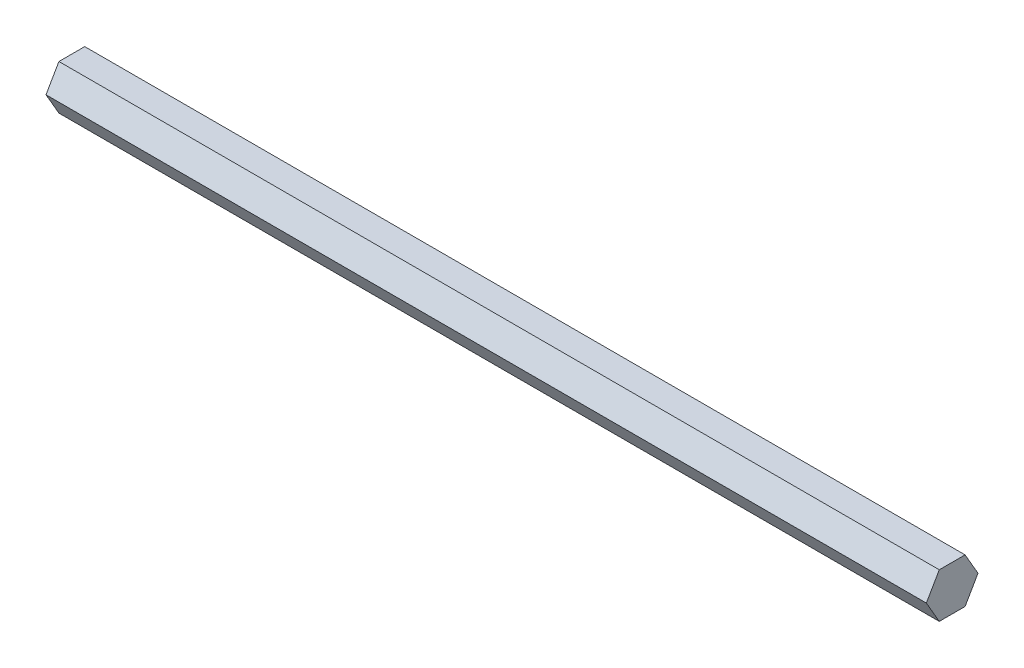
ISO-10303-21;
HEADER;
FILE_DESCRIPTION(('STEP AP214'),'2;1');
FILE_NAME('part.step','',(''),(''),'','','');
FILE_SCHEMA(('AUTOMOTIVE_DESIGN { 1 0 10303 214 1 1 1 1 }'));
ENDSEC;
DATA;
#1=APPLICATION_CONTEXT('core data for automotive mechanical design processes');
#2=APPLICATION_PROTOCOL_DEFINITION('international standard','automotive_design',2000,#1);
#3=PRODUCT_CONTEXT('',#1,'mechanical');
#4=PRODUCT('Part','Part','',(#3));
#5=PRODUCT_RELATED_PRODUCT_CATEGORY('part','',(#4));
#6=PRODUCT_DEFINITION_FORMATION('','',#4);
#7=PRODUCT_DEFINITION_CONTEXT('part definition',#1,'design');
#8=PRODUCT_DEFINITION('design','',#6,#7);
#9=PRODUCT_DEFINITION_SHAPE('','',#8);
#10=(LENGTH_UNIT() NAMED_UNIT(*) SI_UNIT(.MILLI.,.METRE.));
#11=(NAMED_UNIT(*) PLANE_ANGLE_UNIT() SI_UNIT($,.RADIAN.));
#12=(NAMED_UNIT(*) SI_UNIT($,.STERADIAN.) SOLID_ANGLE_UNIT());
#13=UNCERTAINTY_MEASURE_WITH_UNIT(LENGTH_MEASURE(1.E-05),#10,'distance_accuracy_value','');
#14=(GEOMETRIC_REPRESENTATION_CONTEXT(3) GLOBAL_UNCERTAINTY_ASSIGNED_CONTEXT((#13)) GLOBAL_UNIT_ASSIGNED_CONTEXT((#10,
#11,#12)) REPRESENTATION_CONTEXT('',''));
#15=CARTESIAN_POINT('',(0.,0.,0.));
#16=DIRECTION('',(0.,0.,1.));
#17=DIRECTION('',(1.,0.,0.));
#18=AXIS2_PLACEMENT_3D('',#15,#16,#17);
#19=CARTESIAN_POINT('',(250.,-6.34999999999995,-3.66617420935419));
#20=DIRECTION('',(0.,0.499999999999995,0.866025403784442));
#21=DIRECTION('',(0.,-0.866025403784442,0.499999999999995));
#22=AXIS2_PLACEMENT_3D('',#19,#20,#21);
#23=PLANE('',#22);
#24=DIRECTION('',(0.,0.866025403784442,-0.499999999999995));
#25=VECTOR('',#24,1.);
#26=CARTESIAN_POINT('',(0.,-6.34999999999995,-3.66617420935419));
#27=LINE('',#26,#25);
#28=CARTESIAN_POINT('',(0.,-6.34999999999995,-3.66617420935419));
#29=VERTEX_POINT('',#28);
#30=CARTESIAN_POINT('',(0.,0.,-7.33234841870824));
#31=VERTEX_POINT('',#30);
#32=EDGE_CURVE('E128',#29,#31,#27,.T.);
#33=ORIENTED_EDGE('',*,*,#32,.T.);
#34=DIRECTION('',(-1.,0.,0.));
#35=VECTOR('',#34,1.);
#36=CARTESIAN_POINT('',(250.,0.,-7.33234841870824));
#37=LINE('',#36,#35);
#38=CARTESIAN_POINT('',(250.,0.,-7.33234841870824));
#39=VERTEX_POINT('',#38);
#40=EDGE_CURVE('E11',#39,#31,#37,.T.);
#41=ORIENTED_EDGE('',*,*,#40,.F.);
#42=DIRECTION('',(0.,0.866025403784442,-0.499999999999995));
#43=VECTOR('',#42,1.);
#44=CARTESIAN_POINT('',(250.,-6.34999999999995,-3.66617420935419));
#45=LINE('',#44,#43);
#46=CARTESIAN_POINT('',(250.,-6.34999999999995,-3.66617420935419));
#47=VERTEX_POINT('',#46);
#48=EDGE_CURVE('E144',#47,#39,#45,.T.);
#49=ORIENTED_EDGE('',*,*,#48,.F.);
#50=DIRECTION('',(-1.,0.,0.));
#51=VECTOR('',#50,1.);
#52=CARTESIAN_POINT('',(250.,-6.34999999999995,-3.66617420935419));
#53=LINE('',#52,#51);
#54=EDGE_CURVE('E124',#47,#29,#53,.T.);
#55=ORIENTED_EDGE('',*,*,#54,.T.);
#56=EDGE_LOOP('',(#33,#41,#49,#55));
#57=FACE_BOUND('',#56,.T.);
#58=ADVANCED_FACE('F39',(#57),#23,.F.);
#59=CARTESIAN_POINT('',(250.,0.,-7.33234841870824));
#60=DIRECTION('',(0.,-0.500000000000001,0.866025403784438));
#61=DIRECTION('',(0.,-0.866025403784438,-0.500000000000001));
#62=AXIS2_PLACEMENT_3D('',#59,#60,#61);
#63=PLANE('',#62);
#64=DIRECTION('',(0.,0.866025403784438,0.500000000000001));
#65=VECTOR('',#64,1.);
#66=CARTESIAN_POINT('',(0.,0.,-7.33234841870824));
#67=LINE('',#66,#65);
#68=CARTESIAN_POINT('',(0.,6.35,-3.6661742093541));
#69=VERTEX_POINT('',#68);
#70=EDGE_CURVE('E132',#31,#69,#67,.T.);
#71=ORIENTED_EDGE('',*,*,#70,.T.);
#72=DIRECTION('',(-1.,0.,0.));
#73=VECTOR('',#72,1.);
#74=CARTESIAN_POINT('',(250.,6.35,-3.6661742093541));
#75=LINE('',#74,#73);
#76=CARTESIAN_POINT('',(250.,6.35,-3.6661742093541));
#77=VERTEX_POINT('',#76);
#78=EDGE_CURVE('E48',#77,#69,#75,.T.);
#79=ORIENTED_EDGE('',*,*,#78,.F.);
#80=DIRECTION('',(0.,0.866025403784438,0.500000000000001));
#81=VECTOR('',#80,1.);
#82=CARTESIAN_POINT('',(250.,0.,-7.33234841870824));
#83=LINE('',#82,#81);
#84=EDGE_CURVE('E93',#39,#77,#83,.T.);
#85=ORIENTED_EDGE('',*,*,#84,.F.);
#86=ORIENTED_EDGE('',*,*,#40,.T.);
#87=EDGE_LOOP('',(#71,#79,#85,#86));
#88=FACE_BOUND('',#87,.T.);
#89=ADVANCED_FACE('F172',(#88),#63,.F.);
#90=CARTESIAN_POINT('',(250.,6.35,-3.6661742093541));
#91=DIRECTION('',(0.,-1.,0.));
#92=DIRECTION('',(0.,0.,-1.));
#93=AXIS2_PLACEMENT_3D('',#90,#91,#92);
#94=PLANE('',#93);
#95=DIRECTION('',(0.,0.,1.));
#96=VECTOR('',#95,1.);
#97=CARTESIAN_POINT('',(0.,6.35,-3.6661742093541));
#98=LINE('',#97,#96);
#99=CARTESIAN_POINT('',(0.,6.34999999999998,3.66617420935415));
#100=VERTEX_POINT('',#99);
#101=EDGE_CURVE('E135',#69,#100,#98,.T.);
#102=ORIENTED_EDGE('',*,*,#101,.T.);
#103=DIRECTION('',(-1.,0.,0.));
#104=VECTOR('',#103,1.);
#105=CARTESIAN_POINT('',(250.,6.34999999999998,3.66617420935415));
#106=LINE('',#105,#104);
#107=CARTESIAN_POINT('',(250.,6.34999999999998,3.66617420935415));
#108=VERTEX_POINT('',#107);
#109=EDGE_CURVE('E117',#108,#100,#106,.T.);
#110=ORIENTED_EDGE('',*,*,#109,.F.);
#111=DIRECTION('',(0.,0.,1.));
#112=VECTOR('',#111,1.);
#113=CARTESIAN_POINT('',(250.,6.35,-3.6661742093541));
#114=LINE('',#113,#112);
#115=EDGE_CURVE('E106',#77,#108,#114,.T.);
#116=ORIENTED_EDGE('',*,*,#115,.F.);
#117=ORIENTED_EDGE('',*,*,#78,.T.);
#118=EDGE_LOOP('',(#102,#110,#116,#117));
#119=FACE_BOUND('',#118,.T.);
#120=ADVANCED_FACE('F154',(#119),#94,.F.);
#121=CARTESIAN_POINT('',(250.,6.34999999999998,3.66617420935415));
#122=DIRECTION('',(0.,-0.499999999999995,-0.866025403784442));
#123=DIRECTION('',(0.,0.866025403784442,-0.499999999999995));
#124=AXIS2_PLACEMENT_3D('',#121,#122,#123);
#125=PLANE('',#124);
#126=DIRECTION('',(0.,-0.866025403784442,0.499999999999995));
#127=VECTOR('',#126,1.);
#128=CARTESIAN_POINT('',(0.,6.34999999999998,3.66617420935415));
#129=LINE('',#128,#127);
#130=CARTESIAN_POINT('',(0.,0.,7.33234841870824));
#131=VERTEX_POINT('',#130);
#132=EDGE_CURVE('E115',#100,#131,#129,.T.);
#133=ORIENTED_EDGE('',*,*,#132,.T.);
#134=DIRECTION('',(-1.,0.,0.));
#135=VECTOR('',#134,1.);
#136=CARTESIAN_POINT('',(250.,0.,7.33234841870824));
#137=LINE('',#136,#135);
#138=CARTESIAN_POINT('',(250.,0.,7.33234841870824));
#139=VERTEX_POINT('',#138);
#140=EDGE_CURVE('E112',#139,#131,#137,.T.);
#141=ORIENTED_EDGE('',*,*,#140,.F.);
#142=DIRECTION('',(0.,-0.866025403784442,0.499999999999995));
#143=VECTOR('',#142,1.);
#144=CARTESIAN_POINT('',(250.,6.34999999999998,3.66617420935415));
#145=LINE('',#144,#143);
#146=EDGE_CURVE('E100',#108,#139,#145,.T.);
#147=ORIENTED_EDGE('',*,*,#146,.F.);
#148=ORIENTED_EDGE('',*,*,#109,.T.);
#149=EDGE_LOOP('',(#133,#141,#147,#148));
#150=FACE_BOUND('',#149,.T.);
#151=ADVANCED_FACE('F113',(#150),#125,.F.);
#152=CARTESIAN_POINT('',(250.,0.,7.33234841870824));
#153=DIRECTION('',(0.,0.500000000000007,-0.866025403784435));
#154=DIRECTION('',(0.,0.866025403784435,0.500000000000007));
#155=AXIS2_PLACEMENT_3D('',#152,#153,#154);
#156=PLANE('',#155);
#157=DIRECTION('',(0.,-0.866025403784435,-0.500000000000007));
#158=VECTOR('',#157,1.);
#159=CARTESIAN_POINT('',(0.,0.,7.33234841870824));
#160=LINE('',#159,#158);
#161=CARTESIAN_POINT('',(0.,-6.35000000000003,3.66617420935406));
#162=VERTEX_POINT('',#161);
#163=EDGE_CURVE('E79',#131,#162,#160,.T.);
#164=ORIENTED_EDGE('',*,*,#163,.T.);
#165=DIRECTION('',(-1.,0.,0.));
#166=VECTOR('',#165,1.);
#167=CARTESIAN_POINT('',(250.,-6.35000000000003,3.66617420935406));
#168=LINE('',#167,#166);
#169=CARTESIAN_POINT('',(250.,-6.35000000000003,3.66617420935406));
#170=VERTEX_POINT('',#169);
#171=EDGE_CURVE('E118',#170,#162,#168,.T.);
#172=ORIENTED_EDGE('',*,*,#171,.F.);
#173=DIRECTION('',(0.,-0.866025403784435,-0.500000000000007));
#174=VECTOR('',#173,1.);
#175=CARTESIAN_POINT('',(250.,0.,7.33234841870824));
#176=LINE('',#175,#174);
#177=EDGE_CURVE('E104',#139,#170,#176,.T.);
#178=ORIENTED_EDGE('',*,*,#177,.F.);
#179=ORIENTED_EDGE('',*,*,#140,.T.);
#180=EDGE_LOOP('',(#164,#172,#178,#179));
#181=FACE_BOUND('',#180,.T.);
#182=ADVANCED_FACE('F120',(#181),#156,.F.);
#183=CARTESIAN_POINT('',(250.,-6.35000000000003,3.66617420935406));
#184=DIRECTION('',(0.,1.,0.));
#185=DIRECTION('',(0.,0.,1.));
#186=AXIS2_PLACEMENT_3D('',#183,#184,#185);
#187=PLANE('',#186);
#188=DIRECTION('',(0.,0.,-1.));
#189=VECTOR('',#188,1.);
#190=CARTESIAN_POINT('',(0.,-6.35000000000003,3.66617420935406));
#191=LINE('',#190,#189);
#192=EDGE_CURVE('E85',#162,#29,#191,.T.);
#193=ORIENTED_EDGE('',*,*,#192,.T.);
#194=ORIENTED_EDGE('',*,*,#54,.F.);
#195=DIRECTION('',(0.,0.,-1.));
#196=VECTOR('',#195,1.);
#197=CARTESIAN_POINT('',(250.,-6.35000000000003,3.66617420935406));
#198=LINE('',#197,#196);
#199=EDGE_CURVE('E56',#170,#47,#198,.T.);
#200=ORIENTED_EDGE('',*,*,#199,.F.);
#201=ORIENTED_EDGE('',*,*,#171,.T.);
#202=EDGE_LOOP('',(#193,#194,#200,#201));
#203=FACE_BOUND('',#202,.T.);
#204=ADVANCED_FACE('F161',(#203),#187,.F.);
#205=CARTESIAN_POINT('',(250.,0.,0.));
#206=DIRECTION('',(1.,0.,0.));
#207=DIRECTION('',(0.,0.,-1.));
#208=AXIS2_PLACEMENT_3D('',#205,#206,#207);
#209=PLANE('',#208);
#210=ORIENTED_EDGE('',*,*,#48,.T.);
#211=ORIENTED_EDGE('',*,*,#84,.T.);
#212=ORIENTED_EDGE('',*,*,#115,.T.);
#213=ORIENTED_EDGE('',*,*,#146,.T.);
#214=ORIENTED_EDGE('',*,*,#177,.T.);
#215=ORIENTED_EDGE('',*,*,#199,.T.);
#216=EDGE_LOOP('',(#210,#211,#212,#213,#214,#215));
#217=FACE_BOUND('',#216,.T.);
#218=ADVANCED_FACE('F102',(#217),#209,.T.);
#219=CARTESIAN_POINT('',(0.,0.,0.));
#220=DIRECTION('',(1.,0.,0.));
#221=DIRECTION('',(0.,0.,-1.));
#222=AXIS2_PLACEMENT_3D('',#219,#220,#221);
#223=PLANE('',#222);
#224=ORIENTED_EDGE('',*,*,#32,.F.);
#225=ORIENTED_EDGE('',*,*,#192,.F.);
#226=ORIENTED_EDGE('',*,*,#163,.F.);
#227=ORIENTED_EDGE('',*,*,#132,.F.);
#228=ORIENTED_EDGE('',*,*,#101,.F.);
#229=ORIENTED_EDGE('',*,*,#70,.F.);
#230=EDGE_LOOP('',(#224,#225,#226,#227,#228,#229));
#231=FACE_BOUND('',#230,.T.);
#232=ADVANCED_FACE('F157',(#231),#223,.F.);
#233=CLOSED_SHELL('',(#58,#89,#120,#151,#182,#204,#218,#232));
#234=MANIFOLD_SOLID_BREP('B2',#233);
#235=ADVANCED_BREP_SHAPE_REPRESENTATION('',(#18,#234),#14);
#236=SHAPE_DEFINITION_REPRESENTATION(#9,#235);
ENDSEC;
END-ISO-10303-21;
